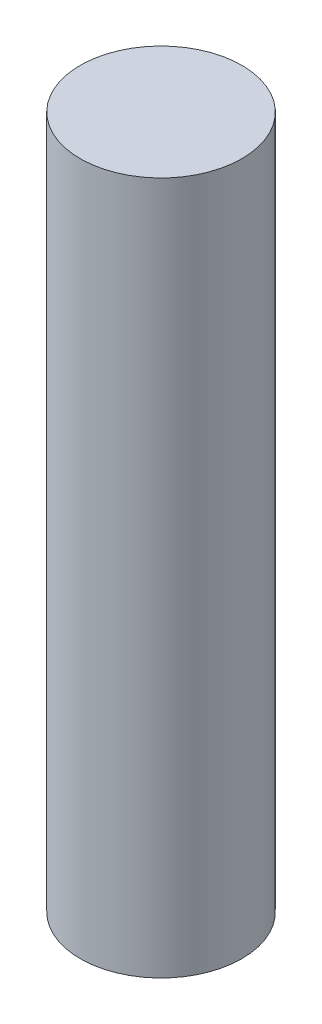
ISO-10303-21;
HEADER;
FILE_DESCRIPTION(('STEP AP214'),'2;1');
FILE_NAME('part.step','',(''),(''),'','','');
FILE_SCHEMA(('AUTOMOTIVE_DESIGN { 1 0 10303 214 1 1 1 1 }'));
ENDSEC;
DATA;
#1=APPLICATION_CONTEXT('core data for automotive mechanical design processes');
#2=APPLICATION_PROTOCOL_DEFINITION('international standard','automotive_design',2000,#1);
#3=PRODUCT_CONTEXT('',#1,'mechanical');
#4=PRODUCT('Part','Part','',(#3));
#5=PRODUCT_RELATED_PRODUCT_CATEGORY('part','',(#4));
#6=PRODUCT_DEFINITION_FORMATION('','',#4);
#7=PRODUCT_DEFINITION_CONTEXT('part definition',#1,'design');
#8=PRODUCT_DEFINITION('design','',#6,#7);
#9=PRODUCT_DEFINITION_SHAPE('','',#8);
#10=(LENGTH_UNIT() NAMED_UNIT(*) SI_UNIT(.MILLI.,.METRE.));
#11=(NAMED_UNIT(*) PLANE_ANGLE_UNIT() SI_UNIT($,.RADIAN.));
#12=(NAMED_UNIT(*) SI_UNIT($,.STERADIAN.) SOLID_ANGLE_UNIT());
#13=UNCERTAINTY_MEASURE_WITH_UNIT(LENGTH_MEASURE(1.E-05),#10,'distance_accuracy_value','');
#14=(GEOMETRIC_REPRESENTATION_CONTEXT(3) GLOBAL_UNCERTAINTY_ASSIGNED_CONTEXT((#13)) GLOBAL_UNIT_ASSIGNED_CONTEXT((#10,
#11,#12)) REPRESENTATION_CONTEXT('',''));
#15=CARTESIAN_POINT('',(0.,0.,0.));
#16=DIRECTION('',(0.,0.,1.));
#17=DIRECTION('',(1.,0.,0.));
#18=AXIS2_PLACEMENT_3D('',#15,#16,#17);
#19=CARTESIAN_POINT('',(0.,60.,0.));
#20=DIRECTION('',(0.,-1.,0.));
#21=DIRECTION('',(0.,0.,-1.));
#22=AXIS2_PLACEMENT_3D('',#19,#20,#21);
#23=CYLINDRICAL_SURFACE('',#22,5.);
#24=CARTESIAN_POINT('',(0.,0.,0.));
#25=DIRECTION('',(0.,1.,0.));
#26=DIRECTION('',(0.,0.,1.));
#27=AXIS2_PLACEMENT_3D('',#24,#25,#26);
#28=CIRCLE('',#27,5.);
#29=CARTESIAN_POINT('',(0.,0.,5.));
#30=VERTEX_POINT('',#29);
#31=EDGE_CURVE('E54',#30,#30,#28,.T.);
#32=ORIENTED_EDGE('',*,*,#31,.F.);
#33=EDGE_LOOP('',(#32));
#34=FACE_BOUND('',#33,.T.);
#35=CARTESIAN_POINT('',(0.,30.,0.));
#36=DIRECTION('',(0.,1.,0.));
#37=DIRECTION('',(0.,0.,1.));
#38=AXIS2_PLACEMENT_3D('',#35,#36,#37);
#39=CIRCLE('',#38,5.);
#40=CARTESIAN_POINT('',(0.,30.,5.));
#41=VERTEX_POINT('',#40);
#42=EDGE_CURVE('E58',#41,#41,#39,.T.);
#43=ORIENTED_EDGE('',*,*,#42,.T.);
#44=EDGE_LOOP('',(#43));
#45=FACE_BOUND('',#44,.T.);
#46=ADVANCED_FACE('F43',(#34,#45),#23,.F.);
#47=CARTESIAN_POINT('',(0.,60.,0.));
#48=DIRECTION('',(0.,1.,0.));
#49=DIRECTION('',(0.,0.,1.));
#50=AXIS2_PLACEMENT_3D('',#47,#48,#49);
#51=PLANE('',#50);
#52=CARTESIAN_POINT('',(0.,60.,0.));
#53=DIRECTION('',(0.,1.,0.));
#54=DIRECTION('',(1.,0.,0.));
#55=AXIS2_PLACEMENT_3D('',#52,#53,#54);
#56=CIRCLE('',#55,7.);
#57=CARTESIAN_POINT('',(7.,60.,0.));
#58=VERTEX_POINT('',#57);
#59=EDGE_CURVE('E11',#58,#58,#56,.T.);
#60=ORIENTED_EDGE('',*,*,#59,.T.);
#61=EDGE_LOOP('',(#60));
#62=FACE_BOUND('',#61,.T.);
#63=ADVANCED_FACE('F74',(#62),#51,.T.);
#64=CARTESIAN_POINT('',(0.,0.,0.));
#65=DIRECTION('',(0.,1.,0.));
#66=DIRECTION('',(0.,0.,1.));
#67=AXIS2_PLACEMENT_3D('',#64,#65,#66);
#68=PLANE('',#67);
#69=CARTESIAN_POINT('',(0.,0.,0.));
#70=DIRECTION('',(0.,1.,0.));
#71=DIRECTION('',(1.,0.,0.));
#72=AXIS2_PLACEMENT_3D('',#69,#70,#71);
#73=CIRCLE('',#72,7.);
#74=CARTESIAN_POINT('',(7.,0.,0.));
#75=VERTEX_POINT('',#74);
#76=EDGE_CURVE('E47',#75,#75,#73,.T.);
#77=ORIENTED_EDGE('',*,*,#76,.F.);
#78=EDGE_LOOP('',(#77));
#79=FACE_BOUND('',#78,.T.);
#80=ORIENTED_EDGE('',*,*,#31,.T.);
#81=EDGE_LOOP('',(#80));
#82=FACE_BOUND('',#81,.T.);
#83=ADVANCED_FACE('F70',(#79,#82),#68,.F.);
#84=CARTESIAN_POINT('',(0.,60.,0.));
#85=DIRECTION('',(0.,-1.,0.));
#86=DIRECTION('',(0.,0.,-1.));
#87=AXIS2_PLACEMENT_3D('',#84,#85,#86);
#88=CYLINDRICAL_SURFACE('',#87,7.);
#89=ORIENTED_EDGE('',*,*,#59,.F.);
#90=EDGE_LOOP('',(#89));
#91=FACE_BOUND('',#90,.T.);
#92=ORIENTED_EDGE('',*,*,#76,.T.);
#93=EDGE_LOOP('',(#92));
#94=FACE_BOUND('',#93,.T.);
#95=ADVANCED_FACE('F45',(#91,#94),#88,.T.);
#96=CARTESIAN_POINT('',(0.,30.,0.));
#97=DIRECTION('',(0.,1.,0.));
#98=DIRECTION('',(0.,0.,1.));
#99=AXIS2_PLACEMENT_3D('',#96,#97,#98);
#100=PLANE('',#99);
#101=ORIENTED_EDGE('',*,*,#42,.F.);
#102=EDGE_LOOP('',(#101));
#103=FACE_BOUND('',#102,.T.);
#104=ADVANCED_FACE('F63',(#103),#100,.F.);
#105=CLOSED_SHELL('',(#46,#63,#83,#95,#104));
#106=MANIFOLD_SOLID_BREP('B2',#105);
#107=ADVANCED_BREP_SHAPE_REPRESENTATION('',(#18,#106),#14);
#108=SHAPE_DEFINITION_REPRESENTATION(#9,#107);
ENDSEC;
END-ISO-10303-21;
